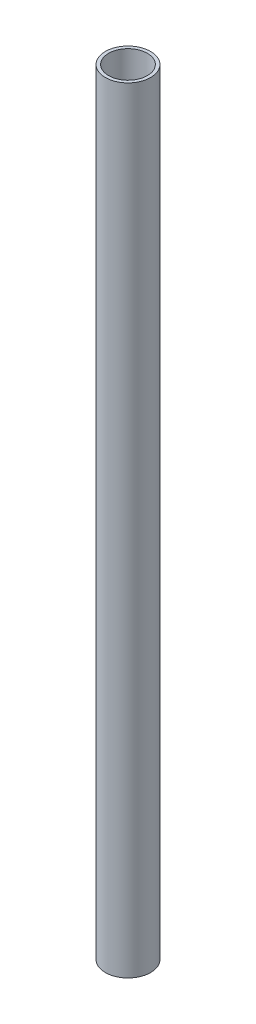
ISO-10303-21;
HEADER;
FILE_DESCRIPTION(('STEP AP214'),'2;1');
FILE_NAME('part.step','',(''),(''),'','','');
FILE_SCHEMA(('AUTOMOTIVE_DESIGN { 1 0 10303 214 1 1 1 1 }'));
ENDSEC;
DATA;
#1=APPLICATION_CONTEXT('core data for automotive mechanical design processes');
#2=APPLICATION_PROTOCOL_DEFINITION('international standard','automotive_design',2000,#1);
#3=PRODUCT_CONTEXT('',#1,'mechanical');
#4=PRODUCT('Part','Part','',(#3));
#5=PRODUCT_RELATED_PRODUCT_CATEGORY('part','',(#4));
#6=PRODUCT_DEFINITION_FORMATION('','',#4);
#7=PRODUCT_DEFINITION_CONTEXT('part definition',#1,'design');
#8=PRODUCT_DEFINITION('design','',#6,#7);
#9=PRODUCT_DEFINITION_SHAPE('','',#8);
#10=(LENGTH_UNIT() NAMED_UNIT(*) SI_UNIT(.MILLI.,.METRE.));
#11=(NAMED_UNIT(*) PLANE_ANGLE_UNIT() SI_UNIT($,.RADIAN.));
#12=(NAMED_UNIT(*) SI_UNIT($,.STERADIAN.) SOLID_ANGLE_UNIT());
#13=UNCERTAINTY_MEASURE_WITH_UNIT(LENGTH_MEASURE(1.E-05),#10,'distance_accuracy_value','');
#14=(GEOMETRIC_REPRESENTATION_CONTEXT(3) GLOBAL_UNCERTAINTY_ASSIGNED_CONTEXT((#13)) GLOBAL_UNIT_ASSIGNED_CONTEXT((#10,
#11,#12)) REPRESENTATION_CONTEXT('',''));
#15=CARTESIAN_POINT('',(0.,0.,0.));
#16=DIRECTION('',(0.,0.,1.));
#17=DIRECTION('',(1.,0.,0.));
#18=AXIS2_PLACEMENT_3D('',#15,#16,#17);
#19=CARTESIAN_POINT('',(0.,60.,0.));
#20=DIRECTION('',(0.,1.,0.));
#21=DIRECTION('',(0.,0.,1.));
#22=AXIS2_PLACEMENT_3D('',#19,#20,#21);
#23=PLANE('',#22);
#24=CARTESIAN_POINT('',(0.,60.,0.));
#25=DIRECTION('',(0.,1.,0.));
#26=DIRECTION('',(0.,0.,1.));
#27=AXIS2_PLACEMENT_3D('',#24,#25,#26);
#28=CIRCLE('',#27,3.5);
#29=CARTESIAN_POINT('',(0.,60.,3.5));
#30=VERTEX_POINT('',#29);
#31=EDGE_CURVE('E10',#30,#30,#28,.T.);
#32=ORIENTED_EDGE('',*,*,#31,.T.);
#33=EDGE_LOOP('',(#32));
#34=FACE_BOUND('',#33,.T.);
#35=CARTESIAN_POINT('',(0.,60.,0.));
#36=DIRECTION('',(0.,1.,0.));
#37=DIRECTION('',(0.,0.,1.));
#38=AXIS2_PLACEMENT_3D('',#35,#36,#37);
#39=CIRCLE('',#38,3.);
#40=CARTESIAN_POINT('',(0.,60.,3.));
#41=VERTEX_POINT('',#40);
#42=EDGE_CURVE('E50',#41,#41,#39,.T.);
#43=ORIENTED_EDGE('',*,*,#42,.F.);
#44=EDGE_LOOP('',(#43));
#45=FACE_BOUND('',#44,.T.);
#46=ADVANCED_FACE('F37',(#34,#45),#23,.T.);
#47=CARTESIAN_POINT('',(0.,-60.,0.));
#48=DIRECTION('',(0.,1.,0.));
#49=DIRECTION('',(0.,0.,1.));
#50=AXIS2_PLACEMENT_3D('',#47,#48,#49);
#51=PLANE('',#50);
#52=CARTESIAN_POINT('',(0.,-60.,0.));
#53=DIRECTION('',(0.,1.,0.));
#54=DIRECTION('',(0.,0.,1.));
#55=AXIS2_PLACEMENT_3D('',#52,#53,#54);
#56=CIRCLE('',#55,3.5);
#57=CARTESIAN_POINT('',(0.,-60.,3.5));
#58=VERTEX_POINT('',#57);
#59=EDGE_CURVE('E41',#58,#58,#56,.T.);
#60=ORIENTED_EDGE('',*,*,#59,.F.);
#61=EDGE_LOOP('',(#60));
#62=FACE_BOUND('',#61,.T.);
#63=CARTESIAN_POINT('',(0.,-60.,0.));
#64=DIRECTION('',(0.,1.,0.));
#65=DIRECTION('',(0.,0.,1.));
#66=AXIS2_PLACEMENT_3D('',#63,#64,#65);
#67=CIRCLE('',#66,3.);
#68=CARTESIAN_POINT('',(0.,-60.,3.));
#69=VERTEX_POINT('',#68);
#70=EDGE_CURVE('E52',#69,#69,#67,.T.);
#71=ORIENTED_EDGE('',*,*,#70,.T.);
#72=EDGE_LOOP('',(#71));
#73=FACE_BOUND('',#72,.T.);
#74=ADVANCED_FACE('F64',(#62,#73),#51,.F.);
#75=CARTESIAN_POINT('',(0.,60.,0.));
#76=DIRECTION('',(0.,-1.,0.));
#77=DIRECTION('',(0.,0.,-1.));
#78=AXIS2_PLACEMENT_3D('',#75,#76,#77);
#79=CYLINDRICAL_SURFACE('',#78,3.5);
#80=ORIENTED_EDGE('',*,*,#31,.F.);
#81=EDGE_LOOP('',(#80));
#82=FACE_BOUND('',#81,.T.);
#83=ORIENTED_EDGE('',*,*,#59,.T.);
#84=EDGE_LOOP('',(#83));
#85=FACE_BOUND('',#84,.T.);
#86=ADVANCED_FACE('F39',(#82,#85),#79,.T.);
#87=CARTESIAN_POINT('',(0.,60.,0.));
#88=DIRECTION('',(0.,-1.,0.));
#89=DIRECTION('',(0.,0.,-1.));
#90=AXIS2_PLACEMENT_3D('',#87,#88,#89);
#91=CYLINDRICAL_SURFACE('',#90,3.);
#92=ORIENTED_EDGE('',*,*,#42,.T.);
#93=EDGE_LOOP('',(#92));
#94=FACE_BOUND('',#93,.T.);
#95=ORIENTED_EDGE('',*,*,#70,.F.);
#96=EDGE_LOOP('',(#95));
#97=FACE_BOUND('',#96,.T.);
#98=ADVANCED_FACE('F60',(#94,#97),#91,.F.);
#99=CLOSED_SHELL('',(#46,#74,#86,#98));
#100=MANIFOLD_SOLID_BREP('B2',#99);
#101=ADVANCED_BREP_SHAPE_REPRESENTATION('',(#18,#100),#14);
#102=SHAPE_DEFINITION_REPRESENTATION(#9,#101);
ENDSEC;
END-ISO-10303-21;
